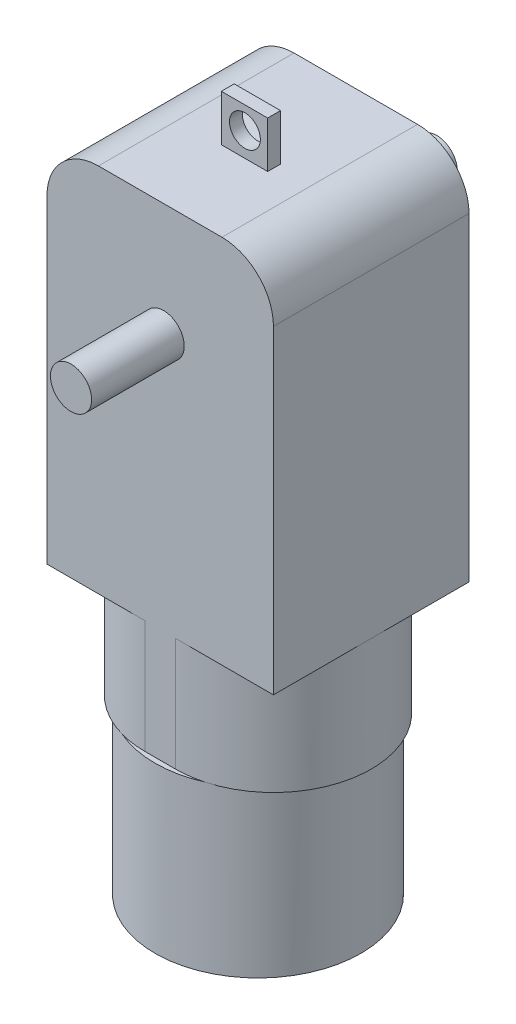
ISO-10303-21;
HEADER;
FILE_DESCRIPTION(('STEP AP214'),'2;1');
FILE_NAME('part.step','',(''),(''),'','','');
FILE_SCHEMA(('AUTOMOTIVE_DESIGN { 1 0 10303 214 1 1 1 1 }'));
ENDSEC;
DATA;
#1=APPLICATION_CONTEXT('core data for automotive mechanical design processes');
#2=APPLICATION_PROTOCOL_DEFINITION('international standard','automotive_design',2000,#1);
#3=PRODUCT_CONTEXT('',#1,'mechanical');
#4=PRODUCT('Part','Part','',(#3));
#5=PRODUCT_RELATED_PRODUCT_CATEGORY('part','',(#4));
#6=PRODUCT_DEFINITION_FORMATION('','',#4);
#7=PRODUCT_DEFINITION_CONTEXT('part definition',#1,'design');
#8=PRODUCT_DEFINITION('design','',#6,#7);
#9=PRODUCT_DEFINITION_SHAPE('','',#8);
#10=(LENGTH_UNIT() NAMED_UNIT(*) SI_UNIT(.MILLI.,.METRE.));
#11=(NAMED_UNIT(*) PLANE_ANGLE_UNIT() SI_UNIT($,.RADIAN.));
#12=(NAMED_UNIT(*) SI_UNIT($,.STERADIAN.) SOLID_ANGLE_UNIT());
#13=UNCERTAINTY_MEASURE_WITH_UNIT(LENGTH_MEASURE(1.E-05),#10,'distance_accuracy_value','');
#14=(GEOMETRIC_REPRESENTATION_CONTEXT(3) GLOBAL_UNCERTAINTY_ASSIGNED_CONTEXT((#13)) GLOBAL_UNIT_ASSIGNED_CONTEXT((#10,
#11,#12)) REPRESENTATION_CONTEXT('',''));
#15=CARTESIAN_POINT('',(0.,0.,0.));
#16=DIRECTION('',(0.,0.,1.));
#17=DIRECTION('',(1.,0.,0.));
#18=AXIS2_PLACEMENT_3D('',#15,#16,#17);
#19=CARTESIAN_POINT('',(9.5,-11.,9.5));
#20=DIRECTION('',(0.,-1.,0.));
#21=DIRECTION('',(0.,0.,-1.));
#22=AXIS2_PLACEMENT_3D('',#19,#20,#21);
#23=PLANE('',#22);
#24=CARTESIAN_POINT('',(11.,-11.,9.5));
#25=DIRECTION('',(0.,-1.,0.));
#26=DIRECTION('',(0.,0.,-1.));
#27=AXIS2_PLACEMENT_3D('',#24,#25,#26);
#28=CIRCLE('',#27,10.);
#29=CARTESIAN_POINT('',(15.0000000000001,-11.,0.33484861008834));
#30=VERTEX_POINT('',#29);
#31=CARTESIAN_POINT('',(15.0000000000001,-11.,18.6651513899117));
#32=VERTEX_POINT('',#31);
#33=EDGE_CURVE('E193',#30,#32,#28,.T.);
#34=ORIENTED_EDGE('',*,*,#33,.F.);
#35=CARTESIAN_POINT('',(12.5,-11.,9.5));
#36=DIRECTION('',(0.,-1.,0.));
#37=DIRECTION('',(0.,0.,-1.));
#38=AXIS2_PLACEMENT_3D('',#35,#36,#37);
#39=CIRCLE('',#38,9.5);
#40=EDGE_CURVE('E331',#30,#32,#39,.T.);
#41=ORIENTED_EDGE('',*,*,#40,.T.);
#42=EDGE_LOOP('',(#34,#41));
#43=FACE_BOUND('',#42,.T.);
#44=ADVANCED_FACE('F39',(#43),#23,.T.);
#45=CARTESIAN_POINT('',(0.,0.,19.));
#46=DIRECTION('',(0.,1.,0.));
#47=DIRECTION('',(0.,0.,1.));
#48=AXIS2_PLACEMENT_3D('',#45,#46,#47);
#49=PLANE('',#48);
#50=CARTESIAN_POINT('',(9.5,0.,9.5));
#51=DIRECTION('',(0.,-1.,0.));
#52=DIRECTION('',(0.,0.,-1.));
#53=AXIS2_PLACEMENT_3D('',#50,#51,#52);
#54=CIRCLE('',#53,9.5);
#55=CARTESIAN_POINT('',(9.5,0.,19.));
#56=VERTEX_POINT('',#55);
#57=CARTESIAN_POINT('',(0.,0.,9.5));
#58=VERTEX_POINT('',#57);
#59=EDGE_CURVE('E203',#56,#58,#54,.T.);
#60=ORIENTED_EDGE('',*,*,#59,.F.);
#61=DIRECTION('',(1.,0.,0.));
#62=VECTOR('',#61,1.);
#63=CARTESIAN_POINT('',(0.,0.,19.));
#64=LINE('',#63,#62);
#65=CARTESIAN_POINT('',(0.,0.,19.));
#66=VERTEX_POINT('',#65);
#67=EDGE_CURVE('E242',#66,#56,#64,.T.);
#68=ORIENTED_EDGE('',*,*,#67,.F.);
#69=DIRECTION('',(0.,0.,-1.));
#70=VECTOR('',#69,1.);
#71=CARTESIAN_POINT('',(0.,0.,19.));
#72=LINE('',#71,#70);
#73=EDGE_CURVE('E263',#66,#58,#72,.T.);
#74=ORIENTED_EDGE('',*,*,#73,.T.);
#75=EDGE_LOOP('',(#60,#68,#74));
#76=FACE_BOUND('',#75,.T.);
#77=ADVANCED_FACE('F341',(#76),#49,.F.);
#78=CARTESIAN_POINT('',(9.5,0.,0.));
#79=VERTEX_POINT('',#78);
#80=EDGE_CURVE('E198',#58,#79,#54,.T.);
#81=ORIENTED_EDGE('',*,*,#80,.F.);
#82=CARTESIAN_POINT('',(0.,0.,0.));
#83=VERTEX_POINT('',#82);
#84=EDGE_CURVE('E266',#58,#83,#72,.T.);
#85=ORIENTED_EDGE('',*,*,#84,.T.);
#86=DIRECTION('',(1.,0.,0.));
#87=VECTOR('',#86,1.);
#88=CARTESIAN_POINT('',(0.,0.,0.));
#89=LINE('',#88,#87);
#90=EDGE_CURVE('E276',#83,#79,#89,.T.);
#91=ORIENTED_EDGE('',*,*,#90,.T.);
#92=EDGE_LOOP('',(#81,#85,#91));
#93=FACE_BOUND('',#92,.T.);
#94=ADVANCED_FACE('F350',(#93),#49,.F.);
#95=CARTESIAN_POINT('',(12.5,0.,9.5));
#96=DIRECTION('',(0.,-1.,0.));
#97=DIRECTION('',(0.,0.,-1.));
#98=AXIS2_PLACEMENT_3D('',#95,#96,#97);
#99=CIRCLE('',#98,9.5);
#100=CARTESIAN_POINT('',(12.5,0.,0.));
#101=VERTEX_POINT('',#100);
#102=CARTESIAN_POINT('',(22.,0.,9.5));
#103=VERTEX_POINT('',#102);
#104=EDGE_CURVE('E181',#101,#103,#99,.T.);
#105=ORIENTED_EDGE('',*,*,#104,.F.);
#106=CARTESIAN_POINT('',(22.,0.,0.));
#107=VERTEX_POINT('',#106);
#108=EDGE_CURVE('E278',#101,#107,#89,.T.);
#109=ORIENTED_EDGE('',*,*,#108,.T.);
#110=DIRECTION('',(0.,0.,-1.));
#111=VECTOR('',#110,1.);
#112=CARTESIAN_POINT('',(22.,0.,19.));
#113=LINE('',#112,#111);
#114=EDGE_CURVE('E269',#103,#107,#113,.T.);
#115=ORIENTED_EDGE('',*,*,#114,.F.);
#116=EDGE_LOOP('',(#105,#109,#115));
#117=FACE_BOUND('',#116,.T.);
#118=ADVANCED_FACE('F411',(#117),#49,.F.);
#119=CARTESIAN_POINT('',(0.,36.,19.));
#120=DIRECTION('',(0.,-1.,0.));
#121=DIRECTION('',(0.,0.,-1.));
#122=AXIS2_PLACEMENT_3D('',#119,#120,#121);
#123=PLANE('',#122);
#124=DIRECTION('',(-1.,0.,0.));
#125=VECTOR('',#124,1.);
#126=CARTESIAN_POINT('',(0.,36.,19.));
#127=LINE('',#126,#125);
#128=CARTESIAN_POINT('',(17.,36.,19.));
#129=VERTEX_POINT('',#128);
#130=CARTESIAN_POINT('',(5.,36.,19.));
#131=VERTEX_POINT('',#130);
#132=EDGE_CURVE('E241',#129,#131,#127,.T.);
#133=ORIENTED_EDGE('',*,*,#132,.F.);
#134=DIRECTION('',(0.,0.,-1.));
#135=VECTOR('',#134,1.);
#136=CARTESIAN_POINT('',(17.,36.,19.));
#137=LINE('',#136,#135);
#138=CARTESIAN_POINT('',(17.,36.,0.));
#139=VERTEX_POINT('',#138);
#140=EDGE_CURVE('E199',#129,#139,#137,.T.);
#141=ORIENTED_EDGE('',*,*,#140,.T.);
#142=DIRECTION('',(-1.,0.,0.));
#143=VECTOR('',#142,1.);
#144=CARTESIAN_POINT('',(0.,36.,0.));
#145=LINE('',#144,#143);
#146=CARTESIAN_POINT('',(5.,36.,0.));
#147=VERTEX_POINT('',#146);
#148=EDGE_CURVE('E270',#139,#147,#145,.T.);
#149=ORIENTED_EDGE('',*,*,#148,.T.);
#150=DIRECTION('',(0.,0.,-1.));
#151=VECTOR('',#150,1.);
#152=CARTESIAN_POINT('',(5.,36.,19.));
#153=LINE('',#152,#151);
#154=EDGE_CURVE('E197',#147,#131,#153,.F.);
#155=ORIENTED_EDGE('',*,*,#154,.T.);
#156=EDGE_LOOP('',(#133,#141,#149,#155));
#157=FACE_BOUND('',#156,.T.);
#158=DIRECTION('',(1.,0.,0.));
#159=VECTOR('',#158,1.);
#160=CARTESIAN_POINT('',(9.19003240980487,36.,11.25));
#161=LINE('',#160,#159);
#162=CARTESIAN_POINT('',(9.19003240980487,36.,11.25));
#163=VERTEX_POINT('',#162);
#164=CARTESIAN_POINT('',(13.6900324098049,36.,11.25));
#165=VERTEX_POINT('',#164);
#166=EDGE_CURVE('E311',#163,#165,#161,.T.);
#167=ORIENTED_EDGE('',*,*,#166,.F.);
#168=DIRECTION('',(0.,0.,-1.));
#169=VECTOR('',#168,1.);
#170=CARTESIAN_POINT('',(9.19003240980487,36.,11.25));
#171=LINE('',#170,#169);
#172=CARTESIAN_POINT('',(9.19003240980487,36.,10.));
#173=VERTEX_POINT('',#172);
#174=EDGE_CURVE('E281',#163,#173,#171,.T.);
#175=ORIENTED_EDGE('',*,*,#174,.T.);
#176=DIRECTION('',(1.,0.,0.));
#177=VECTOR('',#176,1.);
#178=CARTESIAN_POINT('',(9.19003240980487,36.,10.));
#179=LINE('',#178,#177);
#180=CARTESIAN_POINT('',(13.6900324098049,36.,10.));
#181=VERTEX_POINT('',#180);
#182=EDGE_CURVE('E303',#173,#181,#179,.T.);
#183=ORIENTED_EDGE('',*,*,#182,.T.);
#184=DIRECTION('',(0.,0.,-1.));
#185=VECTOR('',#184,1.);
#186=CARTESIAN_POINT('',(13.6900324098049,36.,11.25));
#187=LINE('',#186,#185);
#188=EDGE_CURVE('E288',#165,#181,#187,.T.);
#189=ORIENTED_EDGE('',*,*,#188,.F.);
#190=EDGE_LOOP('',(#167,#175,#183,#189));
#191=FACE_BOUND('',#190,.T.);
#192=ADVANCED_FACE('F408',(#157,#191),#123,.F.);
#193=CARTESIAN_POINT('',(0.,0.,19.));
#194=DIRECTION('',(1.,0.,0.));
#195=DIRECTION('',(0.,0.,-1.));
#196=AXIS2_PLACEMENT_3D('',#193,#194,#195);
#197=PLANE('',#196);
#198=DIRECTION('',(0.,-1.,0.));
#199=VECTOR('',#198,1.);
#200=CARTESIAN_POINT('',(0.,0.,19.));
#201=LINE('',#200,#199);
#202=CARTESIAN_POINT('',(0.,31.,19.));
#203=VERTEX_POINT('',#202);
#204=EDGE_CURVE('E273',#203,#66,#201,.T.);
#205=ORIENTED_EDGE('',*,*,#204,.F.);
#206=DIRECTION('',(0.,0.,-1.));
#207=VECTOR('',#206,1.);
#208=CARTESIAN_POINT('',(0.,31.,19.));
#209=LINE('',#208,#207);
#210=CARTESIAN_POINT('',(0.,31.,0.));
#211=VERTEX_POINT('',#210);
#212=EDGE_CURVE('E47',#203,#211,#209,.T.);
#213=ORIENTED_EDGE('',*,*,#212,.T.);
#214=DIRECTION('',(0.,-1.,0.));
#215=VECTOR('',#214,1.);
#216=CARTESIAN_POINT('',(0.,0.,0.));
#217=LINE('',#216,#215);
#218=EDGE_CURVE('E279',#211,#83,#217,.T.);
#219=ORIENTED_EDGE('',*,*,#218,.T.);
#220=ORIENTED_EDGE('',*,*,#84,.F.);
#221=ORIENTED_EDGE('',*,*,#73,.F.);
#222=EDGE_LOOP('',(#205,#213,#219,#220,#221));
#223=FACE_BOUND('',#222,.T.);
#224=ADVANCED_FACE('F344',(#223),#197,.F.);
#225=CARTESIAN_POINT('',(12.5,0.,19.));
#226=VERTEX_POINT('',#225);
#227=EDGE_CURVE('E201',#103,#226,#99,.T.);
#228=ORIENTED_EDGE('',*,*,#227,.F.);
#229=CARTESIAN_POINT('',(22.,0.,19.));
#230=VERTEX_POINT('',#229);
#231=EDGE_CURVE('E267',#230,#103,#113,.T.);
#232=ORIENTED_EDGE('',*,*,#231,.F.);
#233=EDGE_CURVE('E238',#226,#230,#64,.T.);
#234=ORIENTED_EDGE('',*,*,#233,.F.);
#235=EDGE_LOOP('',(#228,#232,#234));
#236=FACE_BOUND('',#235,.T.);
#237=ADVANCED_FACE('F367',(#236),#49,.F.);
#238=CARTESIAN_POINT('',(22.,0.,19.));
#239=DIRECTION('',(-1.,0.,0.));
#240=DIRECTION('',(0.,0.,1.));
#241=AXIS2_PLACEMENT_3D('',#238,#239,#240);
#242=PLANE('',#241);
#243=DIRECTION('',(0.,1.,0.));
#244=VECTOR('',#243,1.);
#245=CARTESIAN_POINT('',(22.,0.,0.));
#246=LINE('',#245,#244);
#247=CARTESIAN_POINT('',(22.,31.,0.));
#248=VERTEX_POINT('',#247);
#249=EDGE_CURVE('E274',#107,#248,#246,.T.);
#250=ORIENTED_EDGE('',*,*,#249,.T.);
#251=DIRECTION('',(0.,0.,-1.));
#252=VECTOR('',#251,1.);
#253=CARTESIAN_POINT('',(22.,31.,19.));
#254=LINE('',#253,#252);
#255=CARTESIAN_POINT('',(22.,31.,19.));
#256=VERTEX_POINT('',#255);
#257=EDGE_CURVE('E62',#248,#256,#254,.F.);
#258=ORIENTED_EDGE('',*,*,#257,.T.);
#259=DIRECTION('',(0.,1.,0.));
#260=VECTOR('',#259,1.);
#261=CARTESIAN_POINT('',(22.,0.,19.));
#262=LINE('',#261,#260);
#263=EDGE_CURVE('E233',#230,#256,#262,.T.);
#264=ORIENTED_EDGE('',*,*,#263,.F.);
#265=ORIENTED_EDGE('',*,*,#231,.T.);
#266=ORIENTED_EDGE('',*,*,#114,.T.);
#267=EDGE_LOOP('',(#250,#258,#264,#265,#266));
#268=FACE_BOUND('',#267,.T.);
#269=ADVANCED_FACE('F231',(#268),#242,.F.);
#270=CARTESIAN_POINT('',(0.,0.,19.));
#271=DIRECTION('',(0.,0.,-1.));
#272=DIRECTION('',(-1.,0.,0.));
#273=AXIS2_PLACEMENT_3D('',#270,#271,#272);
#274=PLANE('',#273);
#275=CARTESIAN_POINT('',(11.335077521224,25.,19.));
#276=DIRECTION('',(0.,0.,-1.));
#277=DIRECTION('',(-1.,0.,0.));
#278=AXIS2_PLACEMENT_3D('',#275,#276,#277);
#279=CIRCLE('',#278,2.);
#280=CARTESIAN_POINT('',(9.33507752122398,25.,19.));
#281=VERTEX_POINT('',#280);
#282=EDGE_CURVE('E11',#281,#281,#279,.F.);
#283=ORIENTED_EDGE('',*,*,#282,.F.);
#284=EDGE_LOOP('',(#283));
#285=FACE_BOUND('',#284,.T.);
#286=ORIENTED_EDGE('',*,*,#263,.T.);
#287=CARTESIAN_POINT('',(17.,31.,19.));
#288=DIRECTION('',(0.,0.,-1.));
#289=DIRECTION('',(-1.,0.,0.));
#290=AXIS2_PLACEMENT_3D('',#287,#288,#289);
#291=CIRCLE('',#290,5.);
#292=EDGE_CURVE('E235',#256,#129,#291,.F.);
#293=ORIENTED_EDGE('',*,*,#292,.T.);
#294=ORIENTED_EDGE('',*,*,#132,.T.);
#295=CARTESIAN_POINT('',(5.,31.,19.));
#296=DIRECTION('',(0.,0.,-1.));
#297=DIRECTION('',(-1.,0.,0.));
#298=AXIS2_PLACEMENT_3D('',#295,#296,#297);
#299=CIRCLE('',#298,5.);
#300=EDGE_CURVE('E54',#131,#203,#299,.F.);
#301=ORIENTED_EDGE('',*,*,#300,.T.);
#302=ORIENTED_EDGE('',*,*,#204,.T.);
#303=ORIENTED_EDGE('',*,*,#67,.T.);
#304=DIRECTION('',(0.,1.,0.));
#305=VECTOR('',#304,1.);
#306=CARTESIAN_POINT('',(9.5,-11.,19.));
#307=LINE('',#306,#305);
#308=CARTESIAN_POINT('',(9.5,-11.,19.));
#309=VERTEX_POINT('',#308);
#310=EDGE_CURVE('E322',#309,#56,#307,.T.);
#311=ORIENTED_EDGE('',*,*,#310,.F.);
#312=DIRECTION('',(-1.,0.,0.));
#313=VECTOR('',#312,1.);
#314=CARTESIAN_POINT('',(9.5,-11.,19.));
#315=LINE('',#314,#313);
#316=CARTESIAN_POINT('',(12.5,-11.,19.));
#317=VERTEX_POINT('',#316);
#318=EDGE_CURVE('E325',#317,#309,#315,.T.);
#319=ORIENTED_EDGE('',*,*,#318,.F.);
#320=DIRECTION('',(0.,1.,0.));
#321=VECTOR('',#320,1.);
#322=CARTESIAN_POINT('',(12.5,-11.,19.));
#323=LINE('',#322,#321);
#324=EDGE_CURVE('E320',#317,#226,#323,.T.);
#325=ORIENTED_EDGE('',*,*,#324,.T.);
#326=ORIENTED_EDGE('',*,*,#233,.T.);
#327=EDGE_LOOP('',(#286,#293,#294,#301,#302,#303,#311,#319,#325,#326));
#328=FACE_BOUND('',#327,.T.);
#329=ADVANCED_FACE('F228',(#285,#328),#274,.F.);
#330=CARTESIAN_POINT('',(0.,0.,0.));
#331=DIRECTION('',(0.,0.,-1.));
#332=DIRECTION('',(-1.,0.,0.));
#333=AXIS2_PLACEMENT_3D('',#330,#331,#332);
#334=PLANE('',#333);
#335=CARTESIAN_POINT('',(9.86884226955453,25.,0.));
#336=DIRECTION('',(0.,0.,-1.));
#337=DIRECTION('',(-1.,0.,0.));
#338=AXIS2_PLACEMENT_3D('',#335,#336,#337);
#339=CIRCLE('',#338,2.);
#340=CARTESIAN_POINT('',(7.86884226955453,25.,0.));
#341=VERTEX_POINT('',#340);
#342=EDGE_CURVE('E210',#341,#341,#339,.T.);
#343=ORIENTED_EDGE('',*,*,#342,.F.);
#344=EDGE_LOOP('',(#343));
#345=FACE_BOUND('',#344,.T.);
#346=ORIENTED_EDGE('',*,*,#148,.F.);
#347=CARTESIAN_POINT('',(17.,31.,0.));
#348=DIRECTION('',(0.,0.,-1.));
#349=DIRECTION('',(-1.,0.,0.));
#350=AXIS2_PLACEMENT_3D('',#347,#348,#349);
#351=CIRCLE('',#350,5.);
#352=EDGE_CURVE('E253',#139,#248,#351,.T.);
#353=ORIENTED_EDGE('',*,*,#352,.T.);
#354=ORIENTED_EDGE('',*,*,#249,.F.);
#355=ORIENTED_EDGE('',*,*,#108,.F.);
#356=DIRECTION('',(0.,1.,0.));
#357=VECTOR('',#356,1.);
#358=CARTESIAN_POINT('',(12.5,-11.,0.));
#359=LINE('',#358,#357);
#360=CARTESIAN_POINT('',(12.5,-11.,0.));
#361=VERTEX_POINT('',#360);
#362=EDGE_CURVE('E317',#361,#101,#359,.T.);
#363=ORIENTED_EDGE('',*,*,#362,.F.);
#364=DIRECTION('',(1.,0.,0.));
#365=VECTOR('',#364,1.);
#366=CARTESIAN_POINT('',(9.5,-11.,0.));
#367=LINE('',#366,#365);
#368=CARTESIAN_POINT('',(9.5,-11.,0.));
#369=VERTEX_POINT('',#368);
#370=EDGE_CURVE('E333',#369,#361,#367,.T.);
#371=ORIENTED_EDGE('',*,*,#370,.F.);
#372=DIRECTION('',(0.,1.,0.));
#373=VECTOR('',#372,1.);
#374=CARTESIAN_POINT('',(9.5,-11.,0.));
#375=LINE('',#374,#373);
#376=EDGE_CURVE('E178',#369,#79,#375,.T.);
#377=ORIENTED_EDGE('',*,*,#376,.T.);
#378=ORIENTED_EDGE('',*,*,#90,.F.);
#379=ORIENTED_EDGE('',*,*,#218,.F.);
#380=CARTESIAN_POINT('',(5.,31.,0.));
#381=DIRECTION('',(0.,0.,-1.));
#382=DIRECTION('',(-1.,0.,0.));
#383=AXIS2_PLACEMENT_3D('',#380,#381,#382);
#384=CIRCLE('',#383,5.);
#385=EDGE_CURVE('E255',#211,#147,#384,.T.);
#386=ORIENTED_EDGE('',*,*,#385,.T.);
#387=EDGE_LOOP('',(#346,#353,#354,#355,#363,#371,#377,#378,#379,#386));
#388=FACE_BOUND('',#387,.T.);
#389=ADVANCED_FACE('F230',(#345,#388),#334,.T.);
#390=CARTESIAN_POINT('',(9.19003240980487,36.,11.25));
#391=DIRECTION('',(1.,0.,0.));
#392=DIRECTION('',(0.,0.,-1.));
#393=AXIS2_PLACEMENT_3D('',#390,#391,#392);
#394=PLANE('',#393);
#395=DIRECTION('',(0.,-1.,0.));
#396=VECTOR('',#395,1.);
#397=CARTESIAN_POINT('',(9.19003240980487,36.,10.));
#398=LINE('',#397,#396);
#399=CARTESIAN_POINT('',(9.19003240980487,40.5,10.));
#400=VERTEX_POINT('',#399);
#401=EDGE_CURVE('E261',#400,#173,#398,.T.);
#402=ORIENTED_EDGE('',*,*,#401,.T.);
#403=ORIENTED_EDGE('',*,*,#174,.F.);
#404=DIRECTION('',(0.,-1.,0.));
#405=VECTOR('',#404,1.);
#406=CARTESIAN_POINT('',(9.19003240980487,36.,11.25));
#407=LINE('',#406,#405);
#408=CARTESIAN_POINT('',(9.19003240980487,40.5,11.25));
#409=VERTEX_POINT('',#408);
#410=EDGE_CURVE('E300',#409,#163,#407,.T.);
#411=ORIENTED_EDGE('',*,*,#410,.F.);
#412=DIRECTION('',(0.,0.,-1.));
#413=VECTOR('',#412,1.);
#414=CARTESIAN_POINT('',(9.19003240980487,40.5,11.25));
#415=LINE('',#414,#413);
#416=EDGE_CURVE('E294',#409,#400,#415,.T.);
#417=ORIENTED_EDGE('',*,*,#416,.T.);
#418=EDGE_LOOP('',(#402,#403,#411,#417));
#419=FACE_BOUND('',#418,.T.);
#420=ADVANCED_FACE('F400',(#419),#394,.F.);
#421=CARTESIAN_POINT('',(13.6900324098049,36.,11.25));
#422=DIRECTION('',(-1.,0.,0.));
#423=DIRECTION('',(0.,0.,1.));
#424=AXIS2_PLACEMENT_3D('',#421,#422,#423);
#425=PLANE('',#424);
#426=DIRECTION('',(0.,1.,0.));
#427=VECTOR('',#426,1.);
#428=CARTESIAN_POINT('',(13.6900324098049,36.,10.));
#429=LINE('',#428,#427);
#430=CARTESIAN_POINT('',(13.6900324098049,40.5,10.));
#431=VERTEX_POINT('',#430);
#432=EDGE_CURVE('E301',#181,#431,#429,.T.);
#433=ORIENTED_EDGE('',*,*,#432,.T.);
#434=DIRECTION('',(0.,0.,-1.));
#435=VECTOR('',#434,1.);
#436=CARTESIAN_POINT('',(13.6900324098049,40.5,11.25));
#437=LINE('',#436,#435);
#438=CARTESIAN_POINT('',(13.6900324098049,40.5,11.25));
#439=VERTEX_POINT('',#438);
#440=EDGE_CURVE('E291',#439,#431,#437,.T.);
#441=ORIENTED_EDGE('',*,*,#440,.F.);
#442=DIRECTION('',(0.,1.,0.));
#443=VECTOR('',#442,1.);
#444=CARTESIAN_POINT('',(13.6900324098049,36.,11.25));
#445=LINE('',#444,#443);
#446=EDGE_CURVE('E309',#165,#439,#445,.T.);
#447=ORIENTED_EDGE('',*,*,#446,.F.);
#448=ORIENTED_EDGE('',*,*,#188,.T.);
#449=EDGE_LOOP('',(#433,#441,#447,#448));
#450=FACE_BOUND('',#449,.T.);
#451=ADVANCED_FACE('F396',(#450),#425,.F.);
#452=CARTESIAN_POINT('',(9.19003240980487,40.5,11.25));
#453=DIRECTION('',(0.,-1.,0.));
#454=DIRECTION('',(0.,0.,-1.));
#455=AXIS2_PLACEMENT_3D('',#452,#453,#454);
#456=PLANE('',#455);
#457=DIRECTION('',(-1.,0.,0.));
#458=VECTOR('',#457,1.);
#459=CARTESIAN_POINT('',(9.19003240980487,40.5,10.));
#460=LINE('',#459,#458);
#461=EDGE_CURVE('E298',#431,#400,#460,.T.);
#462=ORIENTED_EDGE('',*,*,#461,.T.);
#463=ORIENTED_EDGE('',*,*,#416,.F.);
#464=DIRECTION('',(-1.,0.,0.));
#465=VECTOR('',#464,1.);
#466=CARTESIAN_POINT('',(9.19003240980487,40.5,11.25));
#467=LINE('',#466,#465);
#468=EDGE_CURVE('E297',#439,#409,#467,.T.);
#469=ORIENTED_EDGE('',*,*,#468,.F.);
#470=ORIENTED_EDGE('',*,*,#440,.T.);
#471=EDGE_LOOP('',(#462,#463,#469,#470));
#472=FACE_BOUND('',#471,.T.);
#473=ADVANCED_FACE('F389',(#472),#456,.F.);
#474=CARTESIAN_POINT('',(0.,0.,11.25));
#475=DIRECTION('',(0.,0.,-1.));
#476=DIRECTION('',(-1.,0.,0.));
#477=AXIS2_PLACEMENT_3D('',#474,#475,#476);
#478=PLANE('',#477);
#479=CARTESIAN_POINT('',(11.4784043163922,38.3421788725968,11.25));
#480=DIRECTION('',(0.,0.,1.));
#481=DIRECTION('',(1.,0.,0.));
#482=AXIS2_PLACEMENT_3D('',#479,#480,#481);
#483=CIRCLE('',#482,1.5);
#484=CARTESIAN_POINT('',(12.9784043163922,38.3421788725968,11.25));
#485=VERTEX_POINT('',#484);
#486=EDGE_CURVE('E262',#485,#485,#483,.T.);
#487=ORIENTED_EDGE('',*,*,#486,.F.);
#488=EDGE_LOOP('',(#487));
#489=FACE_BOUND('',#488,.T.);
#490=ORIENTED_EDGE('',*,*,#410,.T.);
#491=ORIENTED_EDGE('',*,*,#166,.T.);
#492=ORIENTED_EDGE('',*,*,#446,.T.);
#493=ORIENTED_EDGE('',*,*,#468,.T.);
#494=EDGE_LOOP('',(#490,#491,#492,#493));
#495=FACE_BOUND('',#494,.T.);
#496=ADVANCED_FACE('F386',(#489,#495),#478,.F.);
#497=CARTESIAN_POINT('',(0.,0.,10.));
#498=DIRECTION('',(0.,0.,-1.));
#499=DIRECTION('',(-1.,0.,0.));
#500=AXIS2_PLACEMENT_3D('',#497,#498,#499);
#501=PLANE('',#500);
#502=CARTESIAN_POINT('',(11.4784043163922,38.3421788725968,10.));
#503=DIRECTION('',(0.,0.,-1.));
#504=DIRECTION('',(-1.,0.,0.));
#505=AXIS2_PLACEMENT_3D('',#502,#503,#504);
#506=CIRCLE('',#505,1.5);
#507=CARTESIAN_POINT('',(12.9784043163922,38.3421788725968,10.));
#508=VERTEX_POINT('',#507);
#509=EDGE_CURVE('E258',#508,#508,#506,.T.);
#510=ORIENTED_EDGE('',*,*,#509,.F.);
#511=EDGE_LOOP('',(#510));
#512=FACE_BOUND('',#511,.T.);
#513=ORIENTED_EDGE('',*,*,#401,.F.);
#514=ORIENTED_EDGE('',*,*,#461,.F.);
#515=ORIENTED_EDGE('',*,*,#432,.F.);
#516=ORIENTED_EDGE('',*,*,#182,.F.);
#517=EDGE_LOOP('',(#513,#514,#515,#516));
#518=FACE_BOUND('',#517,.T.);
#519=ADVANCED_FACE('F384',(#512,#518),#501,.T.);
#520=CARTESIAN_POINT('',(11.4784043163922,38.3421788725968,0.));
#521=DIRECTION('',(0.,0.,1.));
#522=DIRECTION('',(1.,0.,0.));
#523=AXIS2_PLACEMENT_3D('',#520,#521,#522);
#524=CYLINDRICAL_SURFACE('',#523,1.5);
#525=CARTESIAN_POINT('',(12.9784043163922,38.3421788725968,10.));
#526=CARTESIAN_POINT('',(12.9784043163922,38.3421788725968,10.0130208333333));
#527=CARTESIAN_POINT('',(12.9784043163922,38.3421788725968,10.0260416666667));
#528=CARTESIAN_POINT('',(12.9784043163922,38.3421788725968,10.0520833333333));
#529=CARTESIAN_POINT('',(12.9784043163922,38.3421788725968,10.0651041666667));
#530=CARTESIAN_POINT('',(12.9784043163922,38.3421788725968,10.0911458333333));
#531=CARTESIAN_POINT('',(12.9784043163922,38.3421788725968,10.1041666666667));
#532=CARTESIAN_POINT('',(12.9784043163922,38.3421788725968,10.1302083333333));
#533=CARTESIAN_POINT('',(12.9784043163922,38.3421788725968,10.1432291666667));
#534=CARTESIAN_POINT('',(12.9784043163922,38.3421788725968,10.1692708333333));
#535=CARTESIAN_POINT('',(12.9784043163922,38.3421788725968,10.1822916666667));
#536=CARTESIAN_POINT('',(12.9784043163922,38.3421788725968,10.2083333333333));
#537=CARTESIAN_POINT('',(12.9784043163922,38.3421788725968,10.2213541666667));
#538=CARTESIAN_POINT('',(12.9784043163922,38.3421788725968,10.2473958333333));
#539=CARTESIAN_POINT('',(12.9784043163922,38.3421788725968,10.2604166666667));
#540=CARTESIAN_POINT('',(12.9784043163922,38.3421788725968,10.2864583333333));
#541=CARTESIAN_POINT('',(12.9784043163922,38.3421788725968,10.2994791666667));
#542=CARTESIAN_POINT('',(12.9784043163922,38.3421788725968,10.3255208333333));
#543=CARTESIAN_POINT('',(12.9784043163922,38.3421788725968,10.3385416666667));
#544=CARTESIAN_POINT('',(12.9784043163922,38.3421788725968,10.3645833333333));
#545=CARTESIAN_POINT('',(12.9784043163922,38.3421788725968,10.3776041666667));
#546=CARTESIAN_POINT('',(12.9784043163922,38.3421788725968,10.4036458333333));
#547=CARTESIAN_POINT('',(12.9784043163922,38.3421788725968,10.4166666666667));
#548=CARTESIAN_POINT('',(12.9784043163922,38.3421788725968,10.4427083333333));
#549=CARTESIAN_POINT('',(12.9784043163922,38.3421788725968,10.4557291666667));
#550=CARTESIAN_POINT('',(12.9784043163922,38.3421788725968,10.4817708333333));
#551=CARTESIAN_POINT('',(12.9784043163922,38.3421788725968,10.4947916666667));
#552=CARTESIAN_POINT('',(12.9784043163922,38.3421788725968,10.5208333333333));
#553=CARTESIAN_POINT('',(12.9784043163922,38.3421788725968,10.5338541666667));
#554=CARTESIAN_POINT('',(12.9784043163922,38.3421788725968,10.5598958333333));
#555=CARTESIAN_POINT('',(12.9784043163922,38.3421788725968,10.5729166666667));
#556=CARTESIAN_POINT('',(12.9784043163922,38.3421788725968,10.5989583333333));
#557=CARTESIAN_POINT('',(12.9784043163922,38.3421788725968,10.6119791666667));
#558=CARTESIAN_POINT('',(12.9784043163922,38.3421788725968,10.6380208333333));
#559=CARTESIAN_POINT('',(12.9784043163922,38.3421788725968,10.6510416666667));
#560=CARTESIAN_POINT('',(12.9784043163922,38.3421788725968,10.6770833333333));
#561=CARTESIAN_POINT('',(12.9784043163922,38.3421788725968,10.6901041666667));
#562=CARTESIAN_POINT('',(12.9784043163922,38.3421788725968,10.7161458333333));
#563=CARTESIAN_POINT('',(12.9784043163922,38.3421788725968,10.7291666666667));
#564=CARTESIAN_POINT('',(12.9784043163922,38.3421788725968,10.7552083333333));
#565=CARTESIAN_POINT('',(12.9784043163922,38.3421788725968,10.7682291666667));
#566=CARTESIAN_POINT('',(12.9784043163922,38.3421788725968,10.7942708333333));
#567=CARTESIAN_POINT('',(12.9784043163922,38.3421788725968,10.8072916666667));
#568=CARTESIAN_POINT('',(12.9784043163922,38.3421788725968,10.8333333333333));
#569=CARTESIAN_POINT('',(12.9784043163922,38.3421788725968,10.8463541666667));
#570=CARTESIAN_POINT('',(12.9784043163922,38.3421788725968,10.8723958333333));
#571=CARTESIAN_POINT('',(12.9784043163922,38.3421788725968,10.8854166666667));
#572=CARTESIAN_POINT('',(12.9784043163922,38.3421788725968,10.9114583333333));
#573=CARTESIAN_POINT('',(12.9784043163922,38.3421788725968,10.9244791666667));
#574=CARTESIAN_POINT('',(12.9784043163922,38.3421788725968,10.9505208333333));
#575=CARTESIAN_POINT('',(12.9784043163922,38.3421788725968,10.9635416666667));
#576=CARTESIAN_POINT('',(12.9784043163922,38.3421788725968,10.9895833333333));
#577=CARTESIAN_POINT('',(12.9784043163922,38.3421788725968,11.0026041666667));
#578=CARTESIAN_POINT('',(12.9784043163922,38.3421788725968,11.0286458333333));
#579=CARTESIAN_POINT('',(12.9784043163922,38.3421788725968,11.0416666666667));
#580=CARTESIAN_POINT('',(12.9784043163922,38.3421788725968,11.0677083333333));
#581=CARTESIAN_POINT('',(12.9784043163922,38.3421788725968,11.0807291666667));
#582=CARTESIAN_POINT('',(12.9784043163922,38.3421788725968,11.1067708333333));
#583=CARTESIAN_POINT('',(12.9784043163922,38.3421788725968,11.1197916666667));
#584=CARTESIAN_POINT('',(12.9784043163922,38.3421788725968,11.1458333333333));
#585=CARTESIAN_POINT('',(12.9784043163922,38.3421788725968,11.1588541666667));
#586=CARTESIAN_POINT('',(12.9784043163922,38.3421788725968,11.1848958333333));
#587=CARTESIAN_POINT('',(12.9784043163922,38.3421788725968,11.1979166666667));
#588=CARTESIAN_POINT('',(12.9784043163922,38.3421788725968,11.2239583333333));
#589=CARTESIAN_POINT('',(12.9784043163922,38.3421788725968,11.2369791666667));
#590=CARTESIAN_POINT('',(12.9784043163922,38.3421788725968,11.25));
#591=B_SPLINE_CURVE_WITH_KNOTS('',3,(#525,#526,#527,#528,#529,#530,#531,#532,#533,#534,#535,
#536,#537,#538,#539,#540,#541,#542,#543,#544,#545,#546,#547,#548,#549,#550,#551,#552,#553,#554,
#555,#556,#557,#558,#559,#560,#561,#562,#563,#564,#565,#566,#567,#568,#569,#570,#571,#572,#573,
#574,#575,#576,#577,#578,#579,#580,#581,#582,#583,#584,#585,#586,#587,#588,#589,#590),
.UNSPECIFIED.,.F.,.F.,(4,2,2,2,2,2,2,2,2,2,2,2,2,2,2,2,2,2,2,2,2,2,2,2,2,2,2,2,2,2,2,2,4),(0.,
0.0390624999999992,0.0781250000000001,0.117187499999999,0.15625,0.195312499999999,0.234375,
0.273437499999999,0.3125,0.351562499999999,0.390624999999999,0.4296875,0.468749999999999,
0.5078125,0.546874999999999,0.5859375,0.624999999999999,0.664062499999998,0.703124999999999,
0.742187499999998,0.781249999999999,0.820312499999998,0.859374999999999,0.898437499999998,
0.937499999999997,0.976562499999998,1.015625,1.0546875,1.09375,1.1328125,1.171875,1.2109375,
1.25),.UNSPECIFIED.);
#592=EDGE_CURVE('BSEAM379',#508,#485,#591,.T.);
#593=ORIENTED_EDGE('',*,*,#509,.T.);
#594=ORIENTED_EDGE('',*,*,#486,.T.);
#595=ORIENTED_EDGE('',*,*,#592,.T.);
#596=ORIENTED_EDGE('',*,*,#592,.F.);
#597=EDGE_LOOP('',(#593,#595,#594,#596));
#598=FACE_BOUND('',#597,.T.);
#599=ADVANCED_FACE('F379',(#598),#524,.F.);
#600=CARTESIAN_POINT('',(9.5,-11.,9.5));
#601=DIRECTION('',(0.,1.,0.));
#602=DIRECTION('',(0.,0.,1.));
#603=AXIS2_PLACEMENT_3D('',#600,#601,#602);
#604=CYLINDRICAL_SURFACE('',#603,9.5);
#605=ORIENTED_EDGE('',*,*,#59,.T.);
#606=ORIENTED_EDGE('',*,*,#80,.T.);
#607=ORIENTED_EDGE('',*,*,#376,.F.);
#608=CARTESIAN_POINT('',(9.5,-11.,9.5));
#609=DIRECTION('',(0.,-1.,0.));
#610=DIRECTION('',(0.,0.,-1.));
#611=AXIS2_PLACEMENT_3D('',#608,#609,#610);
#612=CIRCLE('',#611,9.5);
#613=CARTESIAN_POINT('',(6.99999999999994,-11.,0.33484861008834));
#614=VERTEX_POINT('',#613);
#615=EDGE_CURVE('E169',#614,#369,#612,.T.);
#616=ORIENTED_EDGE('',*,*,#615,.F.);
#617=CARTESIAN_POINT('',(6.99999999999994,-11.,18.6651513899117));
#618=VERTEX_POINT('',#617);
#619=EDGE_CURVE('E160',#618,#614,#612,.T.);
#620=ORIENTED_EDGE('',*,*,#619,.F.);
#621=EDGE_CURVE('E168',#309,#618,#612,.T.);
#622=ORIENTED_EDGE('',*,*,#621,.F.);
#623=ORIENTED_EDGE('',*,*,#310,.T.);
#624=EDGE_LOOP('',(#605,#606,#607,#616,#620,#622,#623));
#625=FACE_BOUND('',#624,.T.);
#626=ADVANCED_FACE('F175',(#625),#604,.T.);
#627=CARTESIAN_POINT('',(12.5,-11.,9.5));
#628=DIRECTION('',(0.,1.,0.));
#629=DIRECTION('',(0.,0.,1.));
#630=AXIS2_PLACEMENT_3D('',#627,#628,#629);
#631=CYLINDRICAL_SURFACE('',#630,9.5);
#632=ORIENTED_EDGE('',*,*,#104,.T.);
#633=ORIENTED_EDGE('',*,*,#227,.T.);
#634=ORIENTED_EDGE('',*,*,#324,.F.);
#635=EDGE_CURVE('E332',#32,#317,#39,.T.);
#636=ORIENTED_EDGE('',*,*,#635,.F.);
#637=ORIENTED_EDGE('',*,*,#40,.F.);
#638=EDGE_CURVE('E187',#361,#30,#39,.T.);
#639=ORIENTED_EDGE('',*,*,#638,.F.);
#640=ORIENTED_EDGE('',*,*,#362,.T.);
#641=EDGE_LOOP('',(#632,#633,#634,#636,#637,#639,#640));
#642=FACE_BOUND('',#641,.T.);
#643=ADVANCED_FACE('F358',(#642),#631,.T.);
#644=EDGE_CURVE('E164',#618,#614,#28,.T.);
#645=ORIENTED_EDGE('',*,*,#644,.F.);
#646=ORIENTED_EDGE('',*,*,#619,.T.);
#647=EDGE_LOOP('',(#645,#646));
#648=FACE_BOUND('',#647,.T.);
#649=ADVANCED_FACE('F162',(#648),#23,.T.);
#650=CARTESIAN_POINT('',(11.,-11.,9.5));
#651=DIRECTION('',(0.,-1.,0.));
#652=DIRECTION('',(0.,0.,-1.));
#653=AXIS2_PLACEMENT_3D('',#650,#651,#652);
#654=PLANE('',#653);
#655=EDGE_CURVE('E184',#614,#30,#28,.T.);
#656=ORIENTED_EDGE('',*,*,#655,.F.);
#657=ORIENTED_EDGE('',*,*,#615,.T.);
#658=ORIENTED_EDGE('',*,*,#370,.T.);
#659=ORIENTED_EDGE('',*,*,#638,.T.);
#660=EDGE_LOOP('',(#656,#657,#658,#659));
#661=FACE_BOUND('',#660,.T.);
#662=ADVANCED_FACE('F185',(#661),#654,.F.);
#663=ORIENTED_EDGE('',*,*,#318,.T.);
#664=ORIENTED_EDGE('',*,*,#621,.T.);
#665=EDGE_CURVE('E190',#32,#618,#28,.T.);
#666=ORIENTED_EDGE('',*,*,#665,.F.);
#667=ORIENTED_EDGE('',*,*,#635,.T.);
#668=EDGE_LOOP('',(#663,#664,#666,#667));
#669=FACE_BOUND('',#668,.T.);
#670=ADVANCED_FACE('F335',(#669),#654,.F.);
#671=CARTESIAN_POINT('',(11.,-27.,9.5));
#672=DIRECTION('',(0.,1.,0.));
#673=DIRECTION('',(0.,0.,1.));
#674=AXIS2_PLACEMENT_3D('',#671,#672,#673);
#675=CYLINDRICAL_SURFACE('',#674,10.);
#676=CARTESIAN_POINT('',(11.,-27.,9.5));
#677=DIRECTION('',(0.,-1.,0.));
#678=DIRECTION('',(0.,0.,-1.));
#679=AXIS2_PLACEMENT_3D('',#676,#677,#678);
#680=CIRCLE('',#679,10.);
#681=CARTESIAN_POINT('',(11.,-27.,-0.500000000000006));
#682=VERTEX_POINT('',#681);
#683=EDGE_CURVE('E205',#682,#682,#680,.T.);
#684=ORIENTED_EDGE('',*,*,#683,.F.);
#685=EDGE_LOOP('',(#684));
#686=FACE_BOUND('',#685,.T.);
#687=ORIENTED_EDGE('',*,*,#33,.T.);
#688=ORIENTED_EDGE('',*,*,#665,.T.);
#689=ORIENTED_EDGE('',*,*,#644,.T.);
#690=ORIENTED_EDGE('',*,*,#655,.T.);
#691=EDGE_LOOP('',(#687,#688,#689,#690));
#692=FACE_BOUND('',#691,.T.);
#693=ADVANCED_FACE('F195',(#686,#692),#675,.T.);
#694=CARTESIAN_POINT('',(11.,-27.,9.5));
#695=DIRECTION('',(0.,-1.,0.));
#696=DIRECTION('',(0.,0.,-1.));
#697=AXIS2_PLACEMENT_3D('',#694,#695,#696);
#698=PLANE('',#697);
#699=ORIENTED_EDGE('',*,*,#683,.T.);
#700=EDGE_LOOP('',(#699));
#701=FACE_BOUND('',#700,.T.);
#702=ADVANCED_FACE('F419',(#701),#698,.T.);
#703=CARTESIAN_POINT('',(17.,31.,19.));
#704=DIRECTION('',(0.,0.,-1.));
#705=DIRECTION('',(-1.,0.,0.));
#706=AXIS2_PLACEMENT_3D('',#703,#704,#705);
#707=CYLINDRICAL_SURFACE('',#706,5.);
#708=ORIENTED_EDGE('',*,*,#292,.F.);
#709=ORIENTED_EDGE('',*,*,#257,.F.);
#710=ORIENTED_EDGE('',*,*,#352,.F.);
#711=ORIENTED_EDGE('',*,*,#140,.F.);
#712=EDGE_LOOP('',(#708,#709,#710,#711));
#713=FACE_BOUND('',#712,.T.);
#714=ADVANCED_FACE('F246',(#713),#707,.T.);
#715=CARTESIAN_POINT('',(5.,31.,19.));
#716=DIRECTION('',(0.,0.,-1.));
#717=DIRECTION('',(-1.,0.,0.));
#718=AXIS2_PLACEMENT_3D('',#715,#716,#717);
#719=CYLINDRICAL_SURFACE('',#718,5.);
#720=ORIENTED_EDGE('',*,*,#300,.F.);
#721=ORIENTED_EDGE('',*,*,#154,.F.);
#722=ORIENTED_EDGE('',*,*,#385,.F.);
#723=ORIENTED_EDGE('',*,*,#212,.F.);
#724=EDGE_LOOP('',(#720,#721,#722,#723));
#725=FACE_BOUND('',#724,.T.);
#726=ADVANCED_FACE('F41',(#725),#719,.T.);
#727=CARTESIAN_POINT('',(9.86884226955453,25.,-9.));
#728=DIRECTION('',(0.,0.,1.));
#729=DIRECTION('',(1.,0.,0.));
#730=AXIS2_PLACEMENT_3D('',#727,#728,#729);
#731=CYLINDRICAL_SURFACE('',#730,2.);
#732=CARTESIAN_POINT('',(9.86884226955453,25.,-9.));
#733=DIRECTION('',(0.,0.,-1.));
#734=DIRECTION('',(-1.,0.,0.));
#735=AXIS2_PLACEMENT_3D('',#732,#733,#734);
#736=CIRCLE('',#735,2.);
#737=CARTESIAN_POINT('',(7.86884226955453,25.,-9.));
#738=VERTEX_POINT('',#737);
#739=EDGE_CURVE('E191',#738,#738,#736,.T.);
#740=ORIENTED_EDGE('',*,*,#739,.F.);
#741=EDGE_LOOP('',(#740));
#742=FACE_BOUND('',#741,.T.);
#743=ORIENTED_EDGE('',*,*,#342,.T.);
#744=EDGE_LOOP('',(#743));
#745=FACE_BOUND('',#744,.T.);
#746=ADVANCED_FACE('F424',(#742,#745),#731,.T.);
#747=CARTESIAN_POINT('',(9.86884226955453,25.,-9.));
#748=DIRECTION('',(0.,0.,-1.));
#749=DIRECTION('',(-1.,0.,0.));
#750=AXIS2_PLACEMENT_3D('',#747,#748,#749);
#751=PLANE('',#750);
#752=ORIENTED_EDGE('',*,*,#739,.T.);
#753=EDGE_LOOP('',(#752));
#754=FACE_BOUND('',#753,.T.);
#755=ADVANCED_FACE('F224',(#754),#751,.T.);
#756=CARTESIAN_POINT('',(11.335077521224,25.,28.));
#757=DIRECTION('',(0.,0.,-1.));
#758=DIRECTION('',(-1.,0.,0.));
#759=AXIS2_PLACEMENT_3D('',#756,#757,#758);
#760=CYLINDRICAL_SURFACE('',#759,2.);
#761=CARTESIAN_POINT('',(11.335077521224,25.,28.));
#762=DIRECTION('',(0.,0.,1.));
#763=DIRECTION('',(1.,0.,0.));
#764=AXIS2_PLACEMENT_3D('',#761,#762,#763);
#765=CIRCLE('',#764,2.);
#766=CARTESIAN_POINT('',(13.335077521224,25.,28.));
#767=VERTEX_POINT('',#766);
#768=EDGE_CURVE('E213',#767,#767,#765,.T.);
#769=ORIENTED_EDGE('',*,*,#768,.F.);
#770=EDGE_LOOP('',(#769));
#771=FACE_BOUND('',#770,.T.);
#772=ORIENTED_EDGE('',*,*,#282,.T.);
#773=EDGE_LOOP('',(#772));
#774=FACE_BOUND('',#773,.T.);
#775=ADVANCED_FACE('F221',(#771,#774),#760,.T.);
#776=CARTESIAN_POINT('',(11.335077521224,25.,28.));
#777=DIRECTION('',(0.,0.,1.));
#778=DIRECTION('',(1.,0.,0.));
#779=AXIS2_PLACEMENT_3D('',#776,#777,#778);
#780=PLANE('',#779);
#781=ORIENTED_EDGE('',*,*,#768,.T.);
#782=EDGE_LOOP('',(#781));
#783=FACE_BOUND('',#782,.T.);
#784=ADVANCED_FACE('F219',(#783),#780,.T.);
#785=CLOSED_SHELL('',(#44,#77,#94,#118,#192,#224,#237,#269,#329,#389,#420,#451,#473,#496,#519,
#599,#626,#643,#649,#662,#670,#693,#702,#714,#726,#746,#755,#775,#784));
#786=MANIFOLD_SOLID_BREP('B2',#785);
#787=ADVANCED_BREP_SHAPE_REPRESENTATION('',(#18,#786),#14);
#788=SHAPE_DEFINITION_REPRESENTATION(#9,#787);
ENDSEC;
END-ISO-10303-21;
